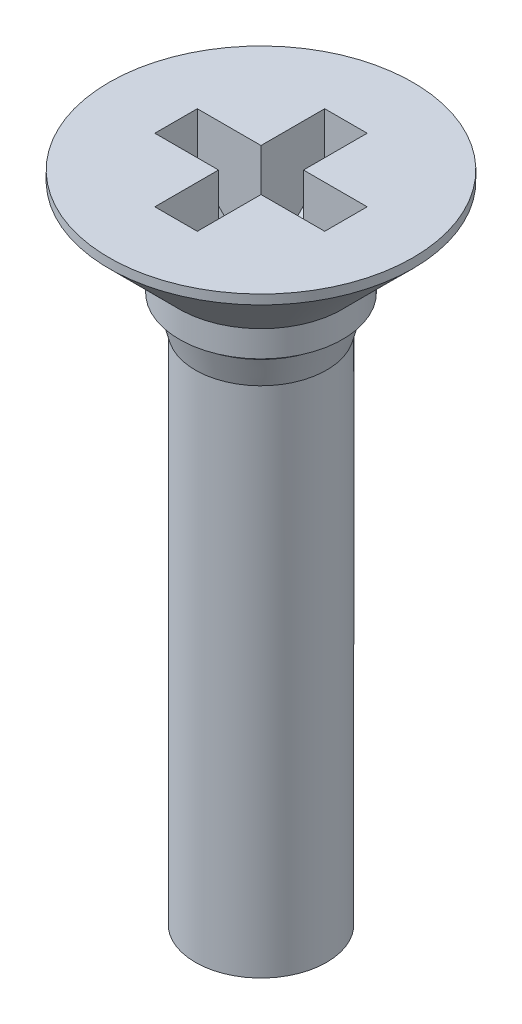
ISO-10303-21;
HEADER;
FILE_DESCRIPTION(('STEP AP214'),'2;1');
FILE_NAME('part.step','',(''),(''),'','','');
FILE_SCHEMA(('AUTOMOTIVE_DESIGN { 1 0 10303 214 1 1 1 1 }'));
ENDSEC;
DATA;
#1=APPLICATION_CONTEXT('core data for automotive mechanical design processes');
#2=APPLICATION_PROTOCOL_DEFINITION('international standard','automotive_design',2000,#1);
#3=PRODUCT_CONTEXT('',#1,'mechanical');
#4=PRODUCT('Part','Part','',(#3));
#5=PRODUCT_RELATED_PRODUCT_CATEGORY('part','',(#4));
#6=PRODUCT_DEFINITION_FORMATION('','',#4);
#7=PRODUCT_DEFINITION_CONTEXT('part definition',#1,'design');
#8=PRODUCT_DEFINITION('design','',#6,#7);
#9=PRODUCT_DEFINITION_SHAPE('','',#8);
#10=(LENGTH_UNIT() NAMED_UNIT(*) SI_UNIT(.MILLI.,.METRE.));
#11=(NAMED_UNIT(*) PLANE_ANGLE_UNIT() SI_UNIT($,.RADIAN.));
#12=(NAMED_UNIT(*) SI_UNIT($,.STERADIAN.) SOLID_ANGLE_UNIT());
#13=UNCERTAINTY_MEASURE_WITH_UNIT(LENGTH_MEASURE(1.E-05),#10,'distance_accuracy_value','');
#14=(GEOMETRIC_REPRESENTATION_CONTEXT(3) GLOBAL_UNCERTAINTY_ASSIGNED_CONTEXT((#13)) GLOBAL_UNIT_ASSIGNED_CONTEXT((#10,
#11,#12)) REPRESENTATION_CONTEXT('',''));
#15=CARTESIAN_POINT('',(0.,0.,0.));
#16=DIRECTION('',(0.,0.,1.));
#17=DIRECTION('',(1.,0.,0.));
#18=AXIS2_PLACEMENT_3D('',#15,#16,#17);
#19=CARTESIAN_POINT('',(0.,-4.2,-0.65));
#20=DIRECTION('',(0.,0.,-1.));
#21=DIRECTION('',(-1.,0.,0.));
#22=AXIS2_PLACEMENT_3D('',#19,#20,#21);
#23=PLANE('',#22);
#24=DIRECTION('',(0.,1.,0.));
#25=VECTOR('',#24,1.);
#26=CARTESIAN_POINT('',(0.65,-4.2,-0.65));
#27=LINE('',#26,#25);
#28=CARTESIAN_POINT('',(0.65,-3.2,-0.65));
#29=VERTEX_POINT('',#28);
#30=CARTESIAN_POINT('',(0.65,0.,-0.65));
#31=VERTEX_POINT('',#30);
#32=EDGE_CURVE('E202',#29,#31,#27,.T.);
#33=ORIENTED_EDGE('',*,*,#32,.F.);
#34=DIRECTION('',(1.,0.,0.));
#35=VECTOR('',#34,1.);
#36=CARTESIAN_POINT('',(-1.,-3.2,-0.65));
#37=LINE('',#36,#35);
#38=CARTESIAN_POINT('',(1.,-3.2,-0.65));
#39=VERTEX_POINT('',#38);
#40=EDGE_CURVE('E237',#29,#39,#37,.T.);
#41=ORIENTED_EDGE('',*,*,#40,.T.);
#42=DIRECTION('',(0.707106781186547,0.707106781186548,0.));
#43=VECTOR('',#42,1.);
#44=CARTESIAN_POINT('',(2.6,-1.6,-0.65));
#45=LINE('',#44,#43);
#46=CARTESIAN_POINT('',(2.6,-1.6,-0.65));
#47=VERTEX_POINT('',#46);
#48=EDGE_CURVE('E241',#39,#47,#45,.T.);
#49=ORIENTED_EDGE('',*,*,#48,.T.);
#50=DIRECTION('',(0.,1.,0.));
#51=VECTOR('',#50,1.);
#52=CARTESIAN_POINT('',(2.6,0.,-0.65));
#53=LINE('',#52,#51);
#54=CARTESIAN_POINT('',(2.6,0.,-0.65));
#55=VERTEX_POINT('',#54);
#56=EDGE_CURVE('E244',#47,#55,#53,.T.);
#57=ORIENTED_EDGE('',*,*,#56,.T.);
#58=DIRECTION('',(-1.,0.,0.));
#59=VECTOR('',#58,1.);
#60=CARTESIAN_POINT('',(2.6,0.,-0.65));
#61=LINE('',#60,#59);
#62=EDGE_CURVE('E248',#55,#31,#61,.T.);
#63=ORIENTED_EDGE('',*,*,#62,.T.);
#64=EDGE_LOOP('',(#33,#41,#49,#57,#63));
#65=FACE_BOUND('',#64,.T.);
#66=ADVANCED_FACE('F37',(#65),#23,.F.);
#67=CARTESIAN_POINT('',(0.,-4.2,0.65));
#68=DIRECTION('',(0.,0.,-1.));
#69=DIRECTION('',(-1.,0.,0.));
#70=AXIS2_PLACEMENT_3D('',#67,#68,#69);
#71=PLANE('',#70);
#72=DIRECTION('',(1.,0.,0.));
#73=VECTOR('',#72,1.);
#74=CARTESIAN_POINT('',(-1.,-3.2,0.65));
#75=LINE('',#74,#73);
#76=CARTESIAN_POINT('',(0.65,-3.2,0.65));
#77=VERTEX_POINT('',#76);
#78=CARTESIAN_POINT('',(1.,-3.2,0.65));
#79=VERTEX_POINT('',#78);
#80=EDGE_CURVE('E219',#77,#79,#75,.T.);
#81=ORIENTED_EDGE('',*,*,#80,.F.);
#82=DIRECTION('',(0.,1.,0.));
#83=VECTOR('',#82,1.);
#84=CARTESIAN_POINT('',(0.65,-4.2,0.65));
#85=LINE('',#84,#83);
#86=CARTESIAN_POINT('',(0.65,0.,0.65));
#87=VERTEX_POINT('',#86);
#88=EDGE_CURVE('E45',#77,#87,#85,.T.);
#89=ORIENTED_EDGE('',*,*,#88,.T.);
#90=DIRECTION('',(-1.,0.,0.));
#91=VECTOR('',#90,1.);
#92=CARTESIAN_POINT('',(2.6,0.,0.65));
#93=LINE('',#92,#91);
#94=CARTESIAN_POINT('',(2.6,0.,0.65));
#95=VERTEX_POINT('',#94);
#96=EDGE_CURVE('E228',#95,#87,#93,.T.);
#97=ORIENTED_EDGE('',*,*,#96,.F.);
#98=DIRECTION('',(0.,1.,0.));
#99=VECTOR('',#98,1.);
#100=CARTESIAN_POINT('',(2.6,0.,0.65));
#101=LINE('',#100,#99);
#102=CARTESIAN_POINT('',(2.6,-1.6,0.65));
#103=VERTEX_POINT('',#102);
#104=EDGE_CURVE('E225',#103,#95,#101,.T.);
#105=ORIENTED_EDGE('',*,*,#104,.F.);
#106=DIRECTION('',(0.707106781186547,0.707106781186548,0.));
#107=VECTOR('',#106,1.);
#108=CARTESIAN_POINT('',(2.6,-1.6,0.65));
#109=LINE('',#108,#107);
#110=EDGE_CURVE('E222',#79,#103,#109,.T.);
#111=ORIENTED_EDGE('',*,*,#110,.F.);
#112=EDGE_LOOP('',(#81,#89,#97,#105,#111));
#113=FACE_BOUND('',#112,.T.);
#114=ADVANCED_FACE('F291',(#113),#71,.T.);
#115=CARTESIAN_POINT('',(0.,0.,0.));
#116=DIRECTION('',(0.,-1.,0.));
#117=DIRECTION('',(1.,0.,0.));
#118=AXIS2_PLACEMENT_3D('',#115,#116,#117);
#119=PLANE('',#118);
#120=DIRECTION('',(1.,0.,0.));
#121=VECTOR('',#120,1.);
#122=CARTESIAN_POINT('',(-0.65,0.,2.6));
#123=LINE('',#122,#121);
#124=CARTESIAN_POINT('',(-0.65,0.,2.6));
#125=VERTEX_POINT('',#124);
#126=CARTESIAN_POINT('',(0.65,0.,2.6));
#127=VERTEX_POINT('',#126);
#128=EDGE_CURVE('E203',#125,#127,#123,.T.);
#129=ORIENTED_EDGE('',*,*,#128,.F.);
#130=DIRECTION('',(0.,0.,1.));
#131=VECTOR('',#130,1.);
#132=CARTESIAN_POINT('',(-0.65,0.,-2.6));
#133=LINE('',#132,#131);
#134=CARTESIAN_POINT('',(-0.65,0.,0.65));
#135=VERTEX_POINT('',#134);
#136=EDGE_CURVE('E196',#135,#125,#133,.T.);
#137=ORIENTED_EDGE('',*,*,#136,.F.);
#138=CARTESIAN_POINT('',(-2.6,0.,0.65));
#139=VERTEX_POINT('',#138);
#140=EDGE_CURVE('E227',#135,#139,#93,.T.);
#141=ORIENTED_EDGE('',*,*,#140,.T.);
#142=DIRECTION('',(0.,0.,1.));
#143=VECTOR('',#142,1.);
#144=CARTESIAN_POINT('',(-2.6,0.,-0.65));
#145=LINE('',#144,#143);
#146=CARTESIAN_POINT('',(-2.6,0.,-0.65));
#147=VERTEX_POINT('',#146);
#148=EDGE_CURVE('E258',#147,#139,#145,.T.);
#149=ORIENTED_EDGE('',*,*,#148,.F.);
#150=CARTESIAN_POINT('',(-0.65,0.,-0.65));
#151=VERTEX_POINT('',#150);
#152=EDGE_CURVE('E247',#151,#147,#61,.T.);
#153=ORIENTED_EDGE('',*,*,#152,.F.);
#154=CARTESIAN_POINT('',(-0.65,0.,-2.6));
#155=VERTEX_POINT('',#154);
#156=EDGE_CURVE('E197',#155,#151,#133,.T.);
#157=ORIENTED_EDGE('',*,*,#156,.F.);
#158=DIRECTION('',(1.,0.,0.));
#159=VECTOR('',#158,1.);
#160=CARTESIAN_POINT('',(-0.65,0.,-2.6));
#161=LINE('',#160,#159);
#162=CARTESIAN_POINT('',(0.65,0.,-2.6));
#163=VERTEX_POINT('',#162);
#164=EDGE_CURVE('E205',#155,#163,#161,.T.);
#165=ORIENTED_EDGE('',*,*,#164,.T.);
#166=DIRECTION('',(0.,0.,1.));
#167=VECTOR('',#166,1.);
#168=CARTESIAN_POINT('',(0.65,0.,-2.6));
#169=LINE('',#168,#167);
#170=EDGE_CURVE('E181',#163,#31,#169,.T.);
#171=ORIENTED_EDGE('',*,*,#170,.T.);
#172=ORIENTED_EDGE('',*,*,#62,.F.);
#173=DIRECTION('',(0.,0.,1.));
#174=VECTOR('',#173,1.);
#175=CARTESIAN_POINT('',(2.6,0.,-0.65));
#176=LINE('',#175,#174);
#177=EDGE_CURVE('E261',#55,#95,#176,.T.);
#178=ORIENTED_EDGE('',*,*,#177,.T.);
#179=ORIENTED_EDGE('',*,*,#96,.T.);
#180=EDGE_CURVE('E60',#87,#127,#169,.T.);
#181=ORIENTED_EDGE('',*,*,#180,.T.);
#182=EDGE_LOOP('',(#129,#137,#141,#149,#153,#157,#165,#171,#172,#178,#179,#181));
#183=FACE_BOUND('',#182,.T.);
#184=CARTESIAN_POINT('',(0.,0.,0.));
#185=DIRECTION('',(0.,1.,0.));
#186=DIRECTION('',(-1.,0.,0.));
#187=AXIS2_PLACEMENT_3D('',#184,#185,#186);
#188=CIRCLE('',#187,4.65);
#189=CARTESIAN_POINT('',(-4.65,0.,0.));
#190=VERTEX_POINT('',#189);
#191=EDGE_CURVE('E287',#190,#190,#188,.T.);
#192=ORIENTED_EDGE('',*,*,#191,.T.);
#193=EDGE_LOOP('',(#192));
#194=FACE_BOUND('',#193,.T.);
#195=ADVANCED_FACE('F39',(#183,#194),#119,.F.);
#196=CARTESIAN_POINT('',(0.,0.,0.));
#197=DIRECTION('',(0.,1.,0.));
#198=DIRECTION('',(-1.,0.,0.));
#199=AXIS2_PLACEMENT_3D('',#196,#197,#198);
#200=CYLINDRICAL_SURFACE('',#199,4.65);
#201=ORIENTED_EDGE('',*,*,#191,.F.);
#202=EDGE_LOOP('',(#201));
#203=FACE_BOUND('',#202,.T.);
#204=CARTESIAN_POINT('',(0.,-0.290000000000009,0.));
#205=DIRECTION('',(0.,1.,0.));
#206=DIRECTION('',(-1.,0.,0.));
#207=AXIS2_PLACEMENT_3D('',#204,#205,#206);
#208=CIRCLE('',#207,4.65);
#209=CARTESIAN_POINT('',(-4.65,-0.290000000000009,0.));
#210=VERTEX_POINT('',#209);
#211=EDGE_CURVE('E284',#210,#210,#208,.T.);
#212=ORIENTED_EDGE('',*,*,#211,.T.);
#213=EDGE_LOOP('',(#212));
#214=FACE_BOUND('',#213,.T.);
#215=ADVANCED_FACE('F396',(#203,#214),#200,.T.);
#216=CARTESIAN_POINT('',(0.,-2.44,0.));
#217=DIRECTION('',(0.,1.,0.));
#218=DIRECTION('',(-1.,0.,0.));
#219=AXIS2_PLACEMENT_3D('',#216,#217,#218);
#220=CONICAL_SURFACE('',#219,2.5,0.78539816339745);
#221=ORIENTED_EDGE('',*,*,#211,.F.);
#222=EDGE_LOOP('',(#221));
#223=FACE_BOUND('',#222,.T.);
#224=CARTESIAN_POINT('',(0.,-2.44,0.));
#225=DIRECTION('',(0.,1.,0.));
#226=DIRECTION('',(-1.,0.,0.));
#227=AXIS2_PLACEMENT_3D('',#224,#225,#226);
#228=CIRCLE('',#227,2.5);
#229=CARTESIAN_POINT('',(-2.5,-2.44,0.));
#230=VERTEX_POINT('',#229);
#231=EDGE_CURVE('E281',#230,#230,#228,.T.);
#232=ORIENTED_EDGE('',*,*,#231,.T.);
#233=EDGE_LOOP('',(#232));
#234=FACE_BOUND('',#233,.T.);
#235=ADVANCED_FACE('F393',(#223,#234),#220,.T.);
#236=CARTESIAN_POINT('',(0.,0.,0.));
#237=DIRECTION('',(0.,1.,0.));
#238=DIRECTION('',(-1.,0.,0.));
#239=AXIS2_PLACEMENT_3D('',#236,#237,#238);
#240=CYLINDRICAL_SURFACE('',#239,2.5);
#241=ORIENTED_EDGE('',*,*,#231,.F.);
#242=EDGE_LOOP('',(#241));
#243=FACE_BOUND('',#242,.T.);
#244=CARTESIAN_POINT('',(0.,-3.24,0.));
#245=DIRECTION('',(0.,1.,0.));
#246=DIRECTION('',(-1.,0.,0.));
#247=AXIS2_PLACEMENT_3D('',#244,#245,#246);
#248=CIRCLE('',#247,2.5);
#249=CARTESIAN_POINT('',(-2.5,-3.24,0.));
#250=VERTEX_POINT('',#249);
#251=EDGE_CURVE('E278',#250,#250,#248,.T.);
#252=ORIENTED_EDGE('',*,*,#251,.T.);
#253=EDGE_LOOP('',(#252));
#254=FACE_BOUND('',#253,.T.);
#255=ADVANCED_FACE('F389',(#243,#254),#240,.T.);
#256=CARTESIAN_POINT('',(2.5,-3.24,0.));
#257=DIRECTION('',(0.,1.,0.));
#258=DIRECTION('',(-1.,0.,0.));
#259=AXIS2_PLACEMENT_3D('',#256,#257,#258);
#260=PLANE('',#259);
#261=ORIENTED_EDGE('',*,*,#251,.F.);
#262=EDGE_LOOP('',(#261));
#263=FACE_BOUND('',#262,.T.);
#264=CARTESIAN_POINT('',(0.,-3.24,0.));
#265=DIRECTION('',(0.,1.,0.));
#266=DIRECTION('',(-1.,0.,0.));
#267=AXIS2_PLACEMENT_3D('',#264,#265,#266);
#268=CIRCLE('',#267,2.24);
#269=CARTESIAN_POINT('',(-2.24,-3.24,0.));
#270=VERTEX_POINT('',#269);
#271=EDGE_CURVE('E275',#270,#270,#268,.T.);
#272=ORIENTED_EDGE('',*,*,#271,.T.);
#273=EDGE_LOOP('',(#272));
#274=FACE_BOUND('',#273,.T.);
#275=ADVANCED_FACE('F385',(#263,#274),#260,.F.);
#276=CARTESIAN_POINT('',(0.,0.,0.));
#277=DIRECTION('',(0.,1.,0.));
#278=DIRECTION('',(-1.,0.,0.));
#279=AXIS2_PLACEMENT_3D('',#276,#277,#278);
#280=CYLINDRICAL_SURFACE('',#279,2.24);
#281=ORIENTED_EDGE('',*,*,#271,.F.);
#282=EDGE_LOOP('',(#281));
#283=FACE_BOUND('',#282,.T.);
#284=CARTESIAN_POINT('',(0.,-3.43976228885538,0.));
#285=DIRECTION('',(0.,1.,0.));
#286=DIRECTION('',(-1.,0.,0.));
#287=AXIS2_PLACEMENT_3D('',#284,#285,#286);
#288=CIRCLE('',#287,2.24);
#289=CARTESIAN_POINT('',(-2.24,-3.43976228885538,0.));
#290=VERTEX_POINT('',#289);
#291=EDGE_CURVE('E272',#290,#290,#288,.T.);
#292=ORIENTED_EDGE('',*,*,#291,.T.);
#293=EDGE_LOOP('',(#292));
#294=FACE_BOUND('',#293,.T.);
#295=ADVANCED_FACE('F381',(#283,#294),#280,.T.);
#296=CARTESIAN_POINT('',(0.,-4.3,0.));
#297=DIRECTION('',(0.,1.,0.));
#298=DIRECTION('',(-1.,0.,0.));
#299=AXIS2_PLACEMENT_3D('',#296,#297,#298);
#300=CONICAL_SURFACE('',#299,2.0095,0.26179938779915);
#301=ORIENTED_EDGE('',*,*,#291,.F.);
#302=EDGE_LOOP('',(#301));
#303=FACE_BOUND('',#302,.T.);
#304=CARTESIAN_POINT('',(0.,-4.3,0.));
#305=DIRECTION('',(0.,1.,0.));
#306=DIRECTION('',(-1.,0.,0.));
#307=AXIS2_PLACEMENT_3D('',#304,#305,#306);
#308=CIRCLE('',#307,2.0095);
#309=CARTESIAN_POINT('',(-2.0095,-4.3,0.));
#310=VERTEX_POINT('',#309);
#311=EDGE_CURVE('E257',#310,#310,#308,.T.);
#312=ORIENTED_EDGE('',*,*,#311,.T.);
#313=EDGE_LOOP('',(#312));
#314=FACE_BOUND('',#313,.T.);
#315=ADVANCED_FACE('F377',(#303,#314),#300,.T.);
#316=CARTESIAN_POINT('',(0.,0.,0.));
#317=DIRECTION('',(0.,1.,0.));
#318=DIRECTION('',(-1.,0.,0.));
#319=AXIS2_PLACEMENT_3D('',#316,#317,#318);
#320=CYLINDRICAL_SURFACE('',#319,2.0095);
#321=ORIENTED_EDGE('',*,*,#311,.F.);
#322=EDGE_LOOP('',(#321));
#323=FACE_BOUND('',#322,.T.);
#324=CARTESIAN_POINT('',(0.,-20.,0.));
#325=DIRECTION('',(0.,-1.,0.));
#326=DIRECTION('',(1.,0.,0.));
#327=AXIS2_PLACEMENT_3D('',#324,#325,#326);
#328=CIRCLE('',#327,2.0095);
#329=CARTESIAN_POINT('',(2.0095,-20.,0.));
#330=VERTEX_POINT('',#329);
#331=EDGE_CURVE('E172',#330,#330,#328,.T.);
#332=ORIENTED_EDGE('',*,*,#331,.F.);
#333=EDGE_LOOP('',(#332));
#334=FACE_BOUND('',#333,.T.);
#335=ADVANCED_FACE('F374',(#323,#334),#320,.T.);
#336=CARTESIAN_POINT('',(-2.6,-1.6,-0.65));
#337=DIRECTION('',(-0.707106781186548,-0.707106781186547,0.));
#338=DIRECTION('',(0.707106781186547,-0.707106781186548,0.));
#339=AXIS2_PLACEMENT_3D('',#336,#337,#338);
#340=PLANE('',#339);
#341=DIRECTION('',(0.,0.,1.));
#342=VECTOR('',#341,1.);
#343=CARTESIAN_POINT('',(-1.,-3.2,-0.65));
#344=LINE('',#343,#342);
#345=CARTESIAN_POINT('',(-1.,-3.2,-0.65));
#346=VERTEX_POINT('',#345);
#347=CARTESIAN_POINT('',(-1.,-3.2,0.65));
#348=VERTEX_POINT('',#347);
#349=EDGE_CURVE('E254',#346,#348,#344,.T.);
#350=ORIENTED_EDGE('',*,*,#349,.F.);
#351=DIRECTION('',(0.707106781186547,-0.707106781186548,0.));
#352=VECTOR('',#351,1.);
#353=CARTESIAN_POINT('',(-2.6,-1.6,-0.65));
#354=LINE('',#353,#352);
#355=CARTESIAN_POINT('',(-2.6,-1.6,-0.65));
#356=VERTEX_POINT('',#355);
#357=EDGE_CURVE('E234',#356,#346,#354,.T.);
#358=ORIENTED_EDGE('',*,*,#357,.F.);
#359=DIRECTION('',(0.,0.,1.));
#360=VECTOR('',#359,1.);
#361=CARTESIAN_POINT('',(-2.6,-1.6,-0.65));
#362=LINE('',#361,#360);
#363=CARTESIAN_POINT('',(-2.6,-1.6,0.65));
#364=VERTEX_POINT('',#363);
#365=EDGE_CURVE('E255',#356,#364,#362,.T.);
#366=ORIENTED_EDGE('',*,*,#365,.T.);
#367=DIRECTION('',(0.707106781186547,-0.707106781186548,0.));
#368=VECTOR('',#367,1.);
#369=CARTESIAN_POINT('',(-2.6,-1.6,0.65));
#370=LINE('',#369,#368);
#371=EDGE_CURVE('E216',#364,#348,#370,.T.);
#372=ORIENTED_EDGE('',*,*,#371,.T.);
#373=EDGE_LOOP('',(#350,#358,#366,#372));
#374=FACE_BOUND('',#373,.T.);
#375=ADVANCED_FACE('F328',(#374),#340,.F.);
#376=CARTESIAN_POINT('',(-2.6,0.,-0.65));
#377=DIRECTION('',(-1.,0.,0.));
#378=DIRECTION('',(0.,0.,1.));
#379=AXIS2_PLACEMENT_3D('',#376,#377,#378);
#380=PLANE('',#379);
#381=ORIENTED_EDGE('',*,*,#365,.F.);
#382=DIRECTION('',(0.,-1.,0.));
#383=VECTOR('',#382,1.);
#384=CARTESIAN_POINT('',(-2.6,0.,-0.65));
#385=LINE('',#384,#383);
#386=EDGE_CURVE('E251',#147,#356,#385,.T.);
#387=ORIENTED_EDGE('',*,*,#386,.F.);
#388=ORIENTED_EDGE('',*,*,#148,.T.);
#389=DIRECTION('',(0.,-1.,0.));
#390=VECTOR('',#389,1.);
#391=CARTESIAN_POINT('',(-2.6,0.,0.65));
#392=LINE('',#391,#390);
#393=EDGE_CURVE('E231',#139,#364,#392,.T.);
#394=ORIENTED_EDGE('',*,*,#393,.T.);
#395=EDGE_LOOP('',(#381,#387,#388,#394));
#396=FACE_BOUND('',#395,.T.);
#397=ADVANCED_FACE('F373',(#396),#380,.F.);
#398=CARTESIAN_POINT('',(2.6,0.,-0.65));
#399=DIRECTION('',(1.,0.,0.));
#400=DIRECTION('',(0.,0.,-1.));
#401=AXIS2_PLACEMENT_3D('',#398,#399,#400);
#402=PLANE('',#401);
#403=ORIENTED_EDGE('',*,*,#177,.F.);
#404=ORIENTED_EDGE('',*,*,#56,.F.);
#405=DIRECTION('',(0.,0.,1.));
#406=VECTOR('',#405,1.);
#407=CARTESIAN_POINT('',(2.6,-1.6,-0.65));
#408=LINE('',#407,#406);
#409=EDGE_CURVE('E264',#47,#103,#408,.T.);
#410=ORIENTED_EDGE('',*,*,#409,.T.);
#411=ORIENTED_EDGE('',*,*,#104,.T.);
#412=EDGE_LOOP('',(#403,#404,#410,#411));
#413=FACE_BOUND('',#412,.T.);
#414=ADVANCED_FACE('F300',(#413),#402,.F.);
#415=CARTESIAN_POINT('',(2.6,-1.6,-0.65));
#416=DIRECTION('',(0.707106781186548,-0.707106781186547,0.));
#417=DIRECTION('',(0.707106781186547,0.707106781186548,0.));
#418=AXIS2_PLACEMENT_3D('',#415,#416,#417);
#419=PLANE('',#418);
#420=ORIENTED_EDGE('',*,*,#409,.F.);
#421=ORIENTED_EDGE('',*,*,#48,.F.);
#422=DIRECTION('',(0.,0.,1.));
#423=VECTOR('',#422,1.);
#424=CARTESIAN_POINT('',(1.,-3.2,-0.65));
#425=LINE('',#424,#423);
#426=EDGE_CURVE('E266',#39,#79,#425,.T.);
#427=ORIENTED_EDGE('',*,*,#426,.T.);
#428=ORIENTED_EDGE('',*,*,#110,.T.);
#429=EDGE_LOOP('',(#420,#421,#427,#428));
#430=FACE_BOUND('',#429,.T.);
#431=ADVANCED_FACE('F306',(#430),#419,.F.);
#432=CARTESIAN_POINT('',(-1.,-3.2,-0.65));
#433=DIRECTION('',(0.,-1.,0.));
#434=DIRECTION('',(0.,0.,-1.));
#435=AXIS2_PLACEMENT_3D('',#432,#433,#434);
#436=PLANE('',#435);
#437=CARTESIAN_POINT('',(-0.65,-3.2,0.65));
#438=VERTEX_POINT('',#437);
#439=EDGE_CURVE('E220',#348,#438,#75,.T.);
#440=ORIENTED_EDGE('',*,*,#439,.T.);
#441=DIRECTION('',(0.,0.,-1.));
#442=VECTOR('',#441,1.);
#443=CARTESIAN_POINT('',(-0.65,-3.2,1.));
#444=LINE('',#443,#442);
#445=CARTESIAN_POINT('',(-0.65,-3.2,1.));
#446=VERTEX_POINT('',#445);
#447=EDGE_CURVE('E156',#446,#438,#444,.T.);
#448=ORIENTED_EDGE('',*,*,#447,.F.);
#449=DIRECTION('',(1.,0.,0.));
#450=VECTOR('',#449,1.);
#451=CARTESIAN_POINT('',(-0.65,-3.2,1.));
#452=LINE('',#451,#450);
#453=CARTESIAN_POINT('',(0.65,-3.2,1.));
#454=VERTEX_POINT('',#453);
#455=EDGE_CURVE('E150',#446,#454,#452,.T.);
#456=ORIENTED_EDGE('',*,*,#455,.T.);
#457=DIRECTION('',(0.,0.,-1.));
#458=VECTOR('',#457,1.);
#459=CARTESIAN_POINT('',(0.65,-3.2,1.));
#460=LINE('',#459,#458);
#461=EDGE_CURVE('E154',#454,#77,#460,.T.);
#462=ORIENTED_EDGE('',*,*,#461,.T.);
#463=ORIENTED_EDGE('',*,*,#80,.T.);
#464=ORIENTED_EDGE('',*,*,#426,.F.);
#465=ORIENTED_EDGE('',*,*,#40,.F.);
#466=CARTESIAN_POINT('',(0.65,-3.2,-1.));
#467=VERTEX_POINT('',#466);
#468=EDGE_CURVE('E52',#29,#467,#460,.T.);
#469=ORIENTED_EDGE('',*,*,#468,.T.);
#470=DIRECTION('',(1.,0.,0.));
#471=VECTOR('',#470,1.);
#472=CARTESIAN_POINT('',(-0.65,-3.2,-1.));
#473=LINE('',#472,#471);
#474=CARTESIAN_POINT('',(-0.65,-3.2,-1.));
#475=VERTEX_POINT('',#474);
#476=EDGE_CURVE('E161',#475,#467,#473,.T.);
#477=ORIENTED_EDGE('',*,*,#476,.F.);
#478=CARTESIAN_POINT('',(-0.65,-3.2,-0.65));
#479=VERTEX_POINT('',#478);
#480=EDGE_CURVE('E188',#479,#475,#444,.T.);
#481=ORIENTED_EDGE('',*,*,#480,.F.);
#482=EDGE_CURVE('E238',#346,#479,#37,.T.);
#483=ORIENTED_EDGE('',*,*,#482,.F.);
#484=ORIENTED_EDGE('',*,*,#349,.T.);
#485=EDGE_LOOP('',(#440,#448,#456,#462,#463,#464,#465,#469,#477,#481,#483,#484));
#486=FACE_BOUND('',#485,.T.);
#487=ADVANCED_FACE('F153',(#486),#436,.F.);
#488=ORIENTED_EDGE('',*,*,#482,.T.);
#489=DIRECTION('',(0.,1.,0.));
#490=VECTOR('',#489,1.);
#491=CARTESIAN_POINT('',(-0.65,-4.2,-0.65));
#492=LINE('',#491,#490);
#493=EDGE_CURVE('E213',#479,#151,#492,.T.);
#494=ORIENTED_EDGE('',*,*,#493,.T.);
#495=ORIENTED_EDGE('',*,*,#152,.T.);
#496=ORIENTED_EDGE('',*,*,#386,.T.);
#497=ORIENTED_EDGE('',*,*,#357,.T.);
#498=EDGE_LOOP('',(#488,#494,#495,#496,#497));
#499=FACE_BOUND('',#498,.T.);
#500=ADVANCED_FACE('F323',(#499),#23,.F.);
#501=DIRECTION('',(0.,1.,0.));
#502=VECTOR('',#501,1.);
#503=CARTESIAN_POINT('',(-0.65,-4.2,0.65));
#504=LINE('',#503,#502);
#505=EDGE_CURVE('E11',#438,#135,#504,.T.);
#506=ORIENTED_EDGE('',*,*,#505,.F.);
#507=ORIENTED_EDGE('',*,*,#439,.F.);
#508=ORIENTED_EDGE('',*,*,#371,.F.);
#509=ORIENTED_EDGE('',*,*,#393,.F.);
#510=ORIENTED_EDGE('',*,*,#140,.F.);
#511=EDGE_LOOP('',(#506,#507,#508,#509,#510));
#512=FACE_BOUND('',#511,.T.);
#513=ADVANCED_FACE('F333',(#512),#71,.T.);
#514=CARTESIAN_POINT('',(-0.65,-1.6,2.6));
#515=DIRECTION('',(0.,-0.707106781186547,0.707106781186548));
#516=DIRECTION('',(0.,-0.707106781186548,-0.707106781186547));
#517=AXIS2_PLACEMENT_3D('',#514,#515,#516);
#518=PLANE('',#517);
#519=ORIENTED_EDGE('',*,*,#455,.F.);
#520=DIRECTION('',(0.,-0.707106781186548,-0.707106781186547));
#521=VECTOR('',#520,1.);
#522=CARTESIAN_POINT('',(-0.65,-1.6,2.6));
#523=LINE('',#522,#521);
#524=CARTESIAN_POINT('',(-0.65,-1.6,2.6));
#525=VERTEX_POINT('',#524);
#526=EDGE_CURVE('E186',#525,#446,#523,.T.);
#527=ORIENTED_EDGE('',*,*,#526,.F.);
#528=DIRECTION('',(1.,0.,0.));
#529=VECTOR('',#528,1.);
#530=CARTESIAN_POINT('',(-0.65,-1.6,2.6));
#531=LINE('',#530,#529);
#532=CARTESIAN_POINT('',(0.65,-1.6,2.6));
#533=VERTEX_POINT('',#532);
#534=EDGE_CURVE('E170',#525,#533,#531,.T.);
#535=ORIENTED_EDGE('',*,*,#534,.T.);
#536=DIRECTION('',(0.,-0.707106781186548,-0.707106781186547));
#537=VECTOR('',#536,1.);
#538=CARTESIAN_POINT('',(0.65,-1.6,2.6));
#539=LINE('',#538,#537);
#540=EDGE_CURVE('E166',#533,#454,#539,.T.);
#541=ORIENTED_EDGE('',*,*,#540,.T.);
#542=EDGE_LOOP('',(#519,#527,#535,#541));
#543=FACE_BOUND('',#542,.T.);
#544=ADVANCED_FACE('F169',(#543),#518,.F.);
#545=CARTESIAN_POINT('',(-0.65,-4.2,0.));
#546=DIRECTION('',(-1.,0.,0.));
#547=DIRECTION('',(0.,0.,1.));
#548=AXIS2_PLACEMENT_3D('',#545,#546,#547);
#549=PLANE('',#548);
#550=ORIENTED_EDGE('',*,*,#505,.T.);
#551=ORIENTED_EDGE('',*,*,#136,.T.);
#552=DIRECTION('',(0.,-1.,0.));
#553=VECTOR('',#552,1.);
#554=CARTESIAN_POINT('',(-0.65,0.,2.6));
#555=LINE('',#554,#553);
#556=EDGE_CURVE('E162',#125,#525,#555,.T.);
#557=ORIENTED_EDGE('',*,*,#556,.T.);
#558=ORIENTED_EDGE('',*,*,#526,.T.);
#559=ORIENTED_EDGE('',*,*,#447,.T.);
#560=EDGE_LOOP('',(#550,#551,#557,#558,#559));
#561=FACE_BOUND('',#560,.T.);
#562=ADVANCED_FACE('F338',(#561),#549,.F.);
#563=CARTESIAN_POINT('',(0.65,-4.2,0.));
#564=DIRECTION('',(-1.,0.,0.));
#565=DIRECTION('',(0.,0.,1.));
#566=AXIS2_PLACEMENT_3D('',#563,#564,#565);
#567=PLANE('',#566);
#568=ORIENTED_EDGE('',*,*,#461,.F.);
#569=ORIENTED_EDGE('',*,*,#540,.F.);
#570=DIRECTION('',(0.,-1.,0.));
#571=VECTOR('',#570,1.);
#572=CARTESIAN_POINT('',(0.65,0.,2.6));
#573=LINE('',#572,#571);
#574=EDGE_CURVE('E184',#127,#533,#573,.T.);
#575=ORIENTED_EDGE('',*,*,#574,.F.);
#576=ORIENTED_EDGE('',*,*,#180,.F.);
#577=ORIENTED_EDGE('',*,*,#88,.F.);
#578=EDGE_LOOP('',(#568,#569,#575,#576,#577));
#579=FACE_BOUND('',#578,.T.);
#580=ADVANCED_FACE('F165',(#579),#567,.T.);
#581=CARTESIAN_POINT('',(-0.65,0.,2.6));
#582=DIRECTION('',(0.,0.,1.));
#583=DIRECTION('',(1.,0.,0.));
#584=AXIS2_PLACEMENT_3D('',#581,#582,#583);
#585=PLANE('',#584);
#586=ORIENTED_EDGE('',*,*,#534,.F.);
#587=ORIENTED_EDGE('',*,*,#556,.F.);
#588=ORIENTED_EDGE('',*,*,#128,.T.);
#589=ORIENTED_EDGE('',*,*,#574,.T.);
#590=EDGE_LOOP('',(#586,#587,#588,#589));
#591=FACE_BOUND('',#590,.T.);
#592=ADVANCED_FACE('F342',(#591),#585,.F.);
#593=ORIENTED_EDGE('',*,*,#480,.T.);
#594=DIRECTION('',(0.,0.707106781186548,-0.707106781186547));
#595=VECTOR('',#594,1.);
#596=CARTESIAN_POINT('',(-0.65,-1.6,-2.6));
#597=LINE('',#596,#595);
#598=CARTESIAN_POINT('',(-0.65,-1.6,-2.6));
#599=VERTEX_POINT('',#598);
#600=EDGE_CURVE('E190',#475,#599,#597,.T.);
#601=ORIENTED_EDGE('',*,*,#600,.T.);
#602=DIRECTION('',(0.,1.,0.));
#603=VECTOR('',#602,1.);
#604=CARTESIAN_POINT('',(-0.65,0.,-2.6));
#605=LINE('',#604,#603);
#606=EDGE_CURVE('E193',#599,#155,#605,.T.);
#607=ORIENTED_EDGE('',*,*,#606,.T.);
#608=ORIENTED_EDGE('',*,*,#156,.T.);
#609=ORIENTED_EDGE('',*,*,#493,.F.);
#610=EDGE_LOOP('',(#593,#601,#607,#608,#609));
#611=FACE_BOUND('',#610,.T.);
#612=ADVANCED_FACE('F320',(#611),#549,.F.);
#613=ORIENTED_EDGE('',*,*,#32,.T.);
#614=ORIENTED_EDGE('',*,*,#170,.F.);
#615=DIRECTION('',(0.,1.,0.));
#616=VECTOR('',#615,1.);
#617=CARTESIAN_POINT('',(0.65,0.,-2.6));
#618=LINE('',#617,#616);
#619=CARTESIAN_POINT('',(0.65,-1.6,-2.6));
#620=VERTEX_POINT('',#619);
#621=EDGE_CURVE('E179',#620,#163,#618,.T.);
#622=ORIENTED_EDGE('',*,*,#621,.F.);
#623=DIRECTION('',(0.,0.707106781186548,-0.707106781186547));
#624=VECTOR('',#623,1.);
#625=CARTESIAN_POINT('',(0.65,-1.6,-2.6));
#626=LINE('',#625,#624);
#627=EDGE_CURVE('E167',#467,#620,#626,.T.);
#628=ORIENTED_EDGE('',*,*,#627,.F.);
#629=ORIENTED_EDGE('',*,*,#468,.F.);
#630=EDGE_LOOP('',(#613,#614,#622,#628,#629));
#631=FACE_BOUND('',#630,.T.);
#632=ADVANCED_FACE('F313',(#631),#567,.T.);
#633=CARTESIAN_POINT('',(-0.65,0.,-2.6));
#634=DIRECTION('',(0.,0.,-1.));
#635=DIRECTION('',(-1.,0.,0.));
#636=AXIS2_PLACEMENT_3D('',#633,#634,#635);
#637=PLANE('',#636);
#638=ORIENTED_EDGE('',*,*,#164,.F.);
#639=ORIENTED_EDGE('',*,*,#606,.F.);
#640=DIRECTION('',(1.,0.,0.));
#641=VECTOR('',#640,1.);
#642=CARTESIAN_POINT('',(-0.65,-1.6,-2.6));
#643=LINE('',#642,#641);
#644=EDGE_CURVE('E208',#599,#620,#643,.T.);
#645=ORIENTED_EDGE('',*,*,#644,.T.);
#646=ORIENTED_EDGE('',*,*,#621,.T.);
#647=EDGE_LOOP('',(#638,#639,#645,#646));
#648=FACE_BOUND('',#647,.T.);
#649=ADVANCED_FACE('F316',(#648),#637,.F.);
#650=CARTESIAN_POINT('',(-0.65,-1.6,-2.6));
#651=DIRECTION('',(0.,-0.707106781186547,-0.707106781186548));
#652=DIRECTION('',(0.,0.707106781186548,-0.707106781186547));
#653=AXIS2_PLACEMENT_3D('',#650,#651,#652);
#654=PLANE('',#653);
#655=ORIENTED_EDGE('',*,*,#644,.F.);
#656=ORIENTED_EDGE('',*,*,#600,.F.);
#657=ORIENTED_EDGE('',*,*,#476,.T.);
#658=ORIENTED_EDGE('',*,*,#627,.T.);
#659=EDGE_LOOP('',(#655,#656,#657,#658));
#660=FACE_BOUND('',#659,.T.);
#661=ADVANCED_FACE('F311',(#660),#654,.F.);
#662=CARTESIAN_POINT('',(0.,-20.,0.));
#663=DIRECTION('',(0.,-1.,0.));
#664=DIRECTION('',(1.,0.,0.));
#665=AXIS2_PLACEMENT_3D('',#662,#663,#664);
#666=PLANE('',#665);
#667=ORIENTED_EDGE('',*,*,#331,.T.);
#668=EDGE_LOOP('',(#667));
#669=FACE_BOUND('',#668,.T.);
#670=ADVANCED_FACE('F419',(#669),#666,.T.);
#671=CLOSED_SHELL('',(#66,#114,#195,#215,#235,#255,#275,#295,#315,#335,#375,#397,#414,#431,#487,
#500,#513,#544,#562,#580,#592,#612,#632,#649,#661,#670));
#672=MANIFOLD_SOLID_BREP('B2',#671);
#673=ADVANCED_BREP_SHAPE_REPRESENTATION('',(#18,#672),#14);
#674=SHAPE_DEFINITION_REPRESENTATION(#9,#673);
ENDSEC;
END-ISO-10303-21;
